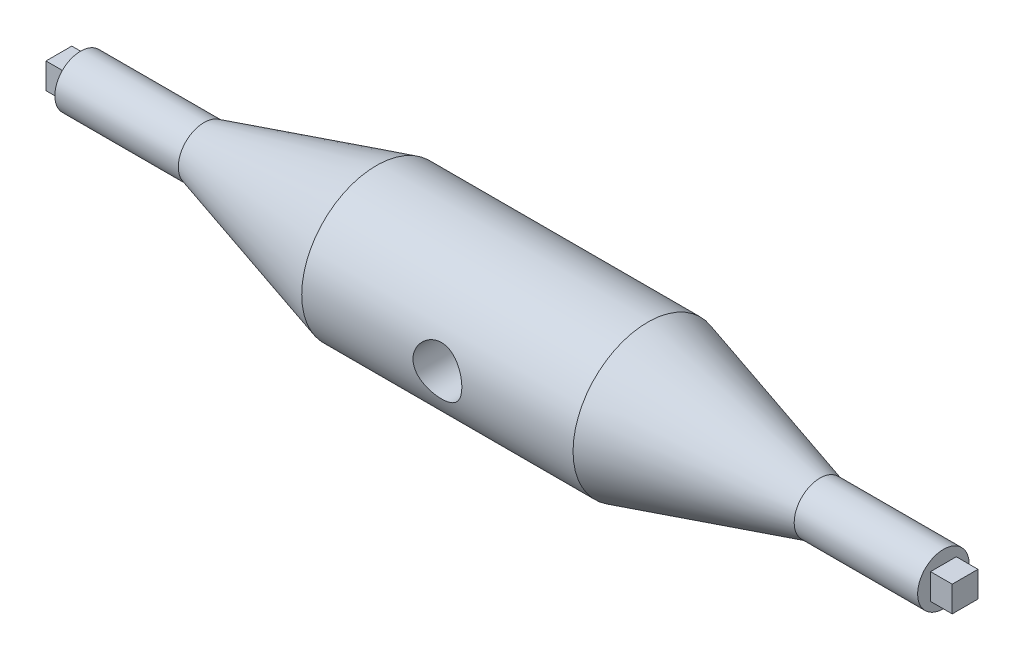
ISO-10303-21;
HEADER;
FILE_DESCRIPTION(('STEP AP214'),'2;1');
FILE_NAME('part.step','',(''),(''),'','','');
FILE_SCHEMA(('AUTOMOTIVE_DESIGN { 1 0 10303 214 1 1 1 1 }'));
ENDSEC;
DATA;
#1=APPLICATION_CONTEXT('core data for automotive mechanical design processes');
#2=APPLICATION_PROTOCOL_DEFINITION('international standard','automotive_design',2000,#1);
#3=PRODUCT_CONTEXT('',#1,'mechanical');
#4=PRODUCT('Part','Part','',(#3));
#5=PRODUCT_RELATED_PRODUCT_CATEGORY('part','',(#4));
#6=PRODUCT_DEFINITION_FORMATION('','',#4);
#7=PRODUCT_DEFINITION_CONTEXT('part definition',#1,'design');
#8=PRODUCT_DEFINITION('design','',#6,#7);
#9=PRODUCT_DEFINITION_SHAPE('','',#8);
#10=(LENGTH_UNIT() NAMED_UNIT(*) SI_UNIT(.MILLI.,.METRE.));
#11=(NAMED_UNIT(*) PLANE_ANGLE_UNIT() SI_UNIT($,.RADIAN.));
#12=(NAMED_UNIT(*) SI_UNIT($,.STERADIAN.) SOLID_ANGLE_UNIT());
#13=UNCERTAINTY_MEASURE_WITH_UNIT(LENGTH_MEASURE(1.E-05),#10,'distance_accuracy_value','');
#14=(GEOMETRIC_REPRESENTATION_CONTEXT(3) GLOBAL_UNCERTAINTY_ASSIGNED_CONTEXT((#13)) GLOBAL_UNIT_ASSIGNED_CONTEXT((#10,
#11,#12)) REPRESENTATION_CONTEXT('',''));
#15=CARTESIAN_POINT('',(0.,0.,0.));
#16=DIRECTION('',(0.,0.,1.));
#17=DIRECTION('',(1.,0.,0.));
#18=AXIS2_PLACEMENT_3D('',#15,#16,#17);
#19=CARTESIAN_POINT('',(0.,0.,-4.75));
#20=DIRECTION('',(-1.,0.,0.));
#21=DIRECTION('',(0.,0.,1.));
#22=AXIS2_PLACEMENT_3D('',#19,#20,#21);
#23=CYLINDRICAL_SURFACE('',#22,13.75);
#24=CARTESIAN_POINT('',(75.,0.,-18.5));
#25=CARTESIAN_POINT('',(74.9999997196814,-0.245786065139316,-18.5000000712777));
#26=CARTESIAN_POINT('',(75.0202027013687,-0.491572326353988,-18.4933485330587));
#27=CARTESIAN_POINT('',(75.1002441111839,-0.975920500530726,-18.4674683670359));
#28=CARTESIAN_POINT('',(75.1600880774559,-1.21448139918467,-18.4482379818772));
#29=CARTESIAN_POINT('',(75.3171511412998,-1.67732577943023,-18.3992930073657));
#30=CARTESIAN_POINT('',(75.4143091203274,-1.90163191306208,-18.3695955690492));
#31=CARTESIAN_POINT('',(75.6429707967424,-2.33076666177639,-18.3027580708703));
#32=CARTESIAN_POINT('',(75.7744808796623,-2.53559164594381,-18.2656166275799));
#33=CARTESIAN_POINT('',(76.0727478312504,-2.92681775758009,-18.1864170822302));
#34=CARTESIAN_POINT('',(76.2404497841196,-3.11247502874366,-18.1442443153947));
#35=CARTESIAN_POINT('',(76.6043298439425,-3.4535939764117,-18.060375843794));
#36=CARTESIAN_POINT('',(76.8005139085173,-3.60904931961388,-18.0186802408109));
#37=CARTESIAN_POINT('',(77.2224094277027,-3.88953413152262,-17.9392347417498));
#38=CARTESIAN_POINT('',(77.4487852197314,-4.01360787205096,-17.9016251176041));
#39=CARTESIAN_POINT('',(77.9206198036274,-4.22160798088068,-17.8363477443379));
#40=CARTESIAN_POINT('',(78.1660729864997,-4.30554609804398,-17.8086770863844));
#41=CARTESIAN_POINT('',(78.6606547117253,-4.42812205917826,-17.767615639146));
#42=CARTESIAN_POINT('',(78.9094014944405,-4.46814968030656,-17.7537880460554));
#43=CARTESIAN_POINT('',(79.4104350955964,-4.50611228151206,-17.7406848706641));
#44=CARTESIAN_POINT('',(79.6627208443762,-4.50405971768691,-17.7414049821165));
#45=CARTESIAN_POINT('',(80.151925709383,-4.45900162574923,-17.7569322356257));
#46=CARTESIAN_POINT('',(80.3890335928492,-4.41779558155579,-17.7711203628433));
#47=CARTESIAN_POINT('',(80.8527649102298,-4.29853044924797,-17.8109742715104));
#48=CARTESIAN_POINT('',(81.0793871277391,-4.22046709715819,-17.8366413809308));
#49=CARTESIAN_POINT('',(81.5198611487837,-4.0284980704993,-17.8970120874566));
#50=CARTESIAN_POINT('',(81.7334571392986,-3.91404982470537,-17.9318510060776));
#51=CARTESIAN_POINT('',(82.1389877034393,-3.65293644946906,-18.0065816008104));
#52=CARTESIAN_POINT('',(82.3309161802689,-3.5062622863455,-18.0464746923953));
#53=CARTESIAN_POINT('',(82.6977938616204,-3.17616239907852,-18.1292682916094));
#54=CARTESIAN_POINT('',(82.8714067469564,-2.99126119375416,-18.1722192312894));
#55=CARTESIAN_POINT('',(83.185502323745,-2.59443790020564,-18.2545326267411));
#56=CARTESIAN_POINT('',(83.3259820627789,-2.3825134065885,-18.2938947625312));
#57=CARTESIAN_POINT('',(83.5708481662276,-1.9349021785258,-18.3650802861685));
#58=CARTESIAN_POINT('',(83.6748881998884,-1.6990135468318,-18.3968304771161));
#59=CARTESIAN_POINT('',(83.8414010068992,-1.21179702443913,-18.4486843636488));
#60=CARTESIAN_POINT('',(83.9038876772946,-0.960474326234213,-18.4687919526773));
#61=CARTESIAN_POINT('',(83.9831796700511,-0.460845626035907,-18.4944555420021));
#62=CARTESIAN_POINT('',(84.001791682075,-0.212855495538742,-18.5005866982776));
#63=CARTESIAN_POINT('',(83.9979369391174,0.282746496029036,-18.4993244880918));
#64=CARTESIAN_POINT('',(83.975476836985,0.530358411860724,-18.4919333119739));
#65=CARTESIAN_POINT('',(83.8915514877486,1.01102211715996,-18.464836123943));
#66=CARTESIAN_POINT('',(83.8311851090193,1.24428725672125,-18.4454772811332));
#67=CARTESIAN_POINT('',(83.6745248294389,1.69729368701772,-18.3967446763095));
#68=CARTESIAN_POINT('',(83.5782263821243,1.91703326227069,-18.3673696469939));
#69=CARTESIAN_POINT('',(83.3496775921739,2.34305791611547,-18.3006566938414));
#70=CARTESIAN_POINT('',(83.2165648451776,2.54885044468066,-18.2631330999466));
#71=CARTESIAN_POINT('',(82.9191854315569,2.93577060041805,-18.1843887162314));
#72=CARTESIAN_POINT('',(82.754909558416,3.11689091144543,-18.1431668357285));
#73=CARTESIAN_POINT('',(82.3913684085962,3.45755805390074,-18.0593926019679));
#74=CARTESIAN_POINT('',(82.1908876198737,3.61581589413316,-18.0168608491164));
#75=CARTESIAN_POINT('',(81.7652973432049,3.8965892208586,-17.9371325997492));
#76=CARTESIAN_POINT('',(81.5401878477072,4.01910469639254,-17.8999361048695));
#77=CARTESIAN_POINT('',(81.0718157437455,4.22428239046055,-17.8354706774745));
#78=CARTESIAN_POINT('',(80.8286029638639,4.30704964748766,-17.8081756267177));
#79=CARTESIAN_POINT('',(80.3305990632936,4.43010358787342,-17.7669495555253));
#80=CARTESIAN_POINT('',(80.0758129612638,4.47040850459463,-17.7530127992596));
#81=CARTESIAN_POINT('',(79.5754767949964,4.50600400809907,-17.7407176260657));
#82=CARTESIAN_POINT('',(79.3300947892978,4.50342648939146,-17.7416213845889));
#83=CARTESIAN_POINT('',(78.8434519232678,4.4585473425561,-17.7570906034487));
#84=CARTESIAN_POINT('',(78.6021908349333,4.4162479194674,-17.7716553054401));
#85=CARTESIAN_POINT('',(78.1348575339261,4.2946112330784,-17.8122657288382));
#86=CARTESIAN_POINT('',(77.9085924744992,4.21594041093321,-17.8381044143385));
#87=CARTESIAN_POINT('',(77.4722973992493,4.02432911786228,-17.8982817337048));
#88=CARTESIAN_POINT('',(77.2622709151489,3.91138121818594,-17.9326222098365));
#89=CARTESIAN_POINT('',(76.8547838312516,3.6488401086801,-18.0077461879882));
#90=CARTESIAN_POINT('',(76.6582312677398,3.49789827282858,-18.0487408666685));
#91=CARTESIAN_POINT('',(76.2925559870872,3.16596135785421,-18.1316447152471));
#92=CARTESIAN_POINT('',(76.1234409236584,2.98495792142142,-18.1735541366274));
#93=CARTESIAN_POINT('',(75.8111378672551,2.58997752466538,-18.2554292010296));
#94=CARTESIAN_POINT('',(75.6691427052122,2.37502731424052,-18.2952652863026));
#95=CARTESIAN_POINT('',(75.4234665997777,1.9230155455172,-18.3667822737995));
#96=CARTESIAN_POINT('',(75.3197742602809,1.68596059029854,-18.3984656008326));
#97=CARTESIAN_POINT('',(75.1589589420307,1.21028269787754,-18.4485994873816));
#98=CARTESIAN_POINT('',(75.0995343289839,0.972506292811256,-18.4676969663001));
#99=CARTESIAN_POINT('',(75.0200599705785,0.489818778014967,-18.4933956088508));
#100=CARTESIAN_POINT('',(75.0000002793188,0.24490948634712,-18.4999999289765));
#101=CARTESIAN_POINT('',(75.,0.,-18.5));
#102=B_SPLINE_CURVE_WITH_KNOTS('',3,(#24,#25,#26,#27,#28,#29,#30,#31,#32,#33,#34,#35,#36,#37,
#38,#39,#40,#41,#42,#43,#44,#45,#46,#47,#48,#49,#50,#51,#52,#53,#54,#55,#56,#57,#58,#59,#60,#61,
#62,#63,#64,#65,#66,#67,#68,#69,#70,#71,#72,#73,#74,#75,#76,#77,#78,#79,#80,#81,#82,#83,#84,#85,
#86,#87,#88,#89,#90,#91,#92,#93,#94,#95,#96,#97,#98,#99,#100,#101),.UNSPECIFIED.,.T.,.F.,(4,2,2,
2,2,2,2,2,2,2,2,2,2,2,2,2,2,2,2,2,2,2,2,2,2,2,2,2,2,2,2,2,2,2,2,2,2,2,4),(0.,0.736457253404454,
1.47301741714014,2.20837624124195,2.94387185473528,3.70159489222123,4.45947665207564,
5.2382284197566,6.01675208441972,6.76985297932246,7.52273095308503,8.24259980871784,
8.96255196548307,9.69378772145332,10.4252287221006,11.193393958387,11.9616276182773,
12.7369763191114,13.5120655828874,14.2546336933887,14.997081533575,15.7189415728673,
16.4408929796724,17.1814461652095,17.9222184739197,18.6953693944345,19.4685205520073,
20.2396171845423,21.0103825724493,21.7429491848238,22.4754751334253,23.1950806292773,
23.914842194212,24.6650663060309,25.415499334965,26.1937376306032,26.9717441928573,
27.705760402709,28.4395911328834),.UNSPECIFIED.);
#103=CARTESIAN_POINT('',(75.,0.,-18.5));
#104=VERTEX_POINT('',#103);
#105=EDGE_CURVE('E192',#104,#104,#102,.T.);
#106=ORIENTED_EDGE('',*,*,#105,.T.);
#107=EDGE_LOOP('',(#106));
#108=FACE_BOUND('',#107,.T.);
#109=CARTESIAN_POINT('',(104.5,0.,-4.75));
#110=DIRECTION('',(-1.,0.,0.));
#111=DIRECTION('',(0.,0.,1.));
#112=AXIS2_PLACEMENT_3D('',#109,#110,#111);
#113=CIRCLE('',#112,13.75);
#114=CARTESIAN_POINT('',(104.5,0.,8.99999999999999));
#115=VERTEX_POINT('',#114);
#116=EDGE_CURVE('E185',#115,#115,#113,.T.);
#117=ORIENTED_EDGE('',*,*,#116,.T.);
#118=EDGE_LOOP('',(#117));
#119=FACE_BOUND('',#118,.T.);
#120=CARTESIAN_POINT('',(54.5,0.,-4.75));
#121=DIRECTION('',(-1.,0.,0.));
#122=DIRECTION('',(0.,0.,1.));
#123=AXIS2_PLACEMENT_3D('',#120,#121,#122);
#124=CIRCLE('',#123,13.75);
#125=CARTESIAN_POINT('',(54.5,0.,9.));
#126=VERTEX_POINT('',#125);
#127=EDGE_CURVE('E182',#126,#126,#124,.T.);
#128=ORIENTED_EDGE('',*,*,#127,.F.);
#129=EDGE_LOOP('',(#128));
#130=FACE_BOUND('',#129,.T.);
#131=CARTESIAN_POINT('',(84.,0.,8.99999999999999));
#132=CARTESIAN_POINT('',(84.0000002803185,-0.24578606513933,9.00000007127768));
#133=CARTESIAN_POINT('',(83.9797972986312,-0.491572326354004,8.99334853305867));
#134=CARTESIAN_POINT('',(83.899755888816,-0.97592050053074,8.96746836703592));
#135=CARTESIAN_POINT('',(83.839911922544,-1.21448139918468,8.94823798187723));
#136=CARTESIAN_POINT('',(83.6828488587002,-1.67732577943025,8.89929300736574));
#137=CARTESIAN_POINT('',(83.5856908796725,-1.9016319130621,8.8695955690492));
#138=CARTESIAN_POINT('',(83.3570292032575,-2.33076666177641,8.8027580708703));
#139=CARTESIAN_POINT('',(83.2255191203376,-2.53559164594383,8.76561662757989));
#140=CARTESIAN_POINT('',(82.9272521687495,-2.9268177575801,8.68641708223022));
#141=CARTESIAN_POINT('',(82.7595502158803,-3.11247502874367,8.64424431539467));
#142=CARTESIAN_POINT('',(82.3956701560575,-3.45359397641171,8.56037584379399));
#143=CARTESIAN_POINT('',(82.1994860914827,-3.60904931961389,8.51868024081089));
#144=CARTESIAN_POINT('',(81.7775905722972,-3.88953413152263,8.4392347417498));
#145=CARTESIAN_POINT('',(81.5512147802685,-4.01360787205097,8.40162511760413));
#146=CARTESIAN_POINT('',(81.0793801963725,-4.22160798088068,8.33634774433792));
#147=CARTESIAN_POINT('',(80.8339270135003,-4.30554609804399,8.30867708638435));
#148=CARTESIAN_POINT('',(80.3393452882746,-4.42812205917826,8.26761563914595));
#149=CARTESIAN_POINT('',(80.0905985055594,-4.46814968030656,8.25378804605537));
#150=CARTESIAN_POINT('',(79.5895649044036,-4.50611228151206,8.24068487066413));
#151=CARTESIAN_POINT('',(79.3372791556237,-4.50405971768691,8.24140498211653));
#152=CARTESIAN_POINT('',(78.8480742906169,-4.45900162574923,8.25693223562571));
#153=CARTESIAN_POINT('',(78.6109664071507,-4.41779558155579,8.27112036284326));
#154=CARTESIAN_POINT('',(78.1472350897701,-4.29853044924797,8.31097427151042));
#155=CARTESIAN_POINT('',(77.9206128722608,-4.22046709715819,8.33664138093084));
#156=CARTESIAN_POINT('',(77.4801388512162,-4.0284980704993,8.39701208745663));
#157=CARTESIAN_POINT('',(77.2665428607014,-3.91404982470536,8.43185100607758));
#158=CARTESIAN_POINT('',(76.8610122965606,-3.65293644946905,8.50658160081036));
#159=CARTESIAN_POINT('',(76.669083819731,-3.50626228634549,8.54647469239532));
#160=CARTESIAN_POINT('',(76.3022061383796,-3.17616239907851,8.62926829160939));
#161=CARTESIAN_POINT('',(76.1285932530435,-2.99126119375416,8.6722192312894));
#162=CARTESIAN_POINT('',(75.8144976762549,-2.59443790020563,8.75453262674113));
#163=CARTESIAN_POINT('',(75.6740179372211,-2.38251340658849,8.7938947625312));
#164=CARTESIAN_POINT('',(75.4291518337723,-1.93490217852579,8.86508028616849));
#165=CARTESIAN_POINT('',(75.3251118001116,-1.6990135468318,8.89683047711615));
#166=CARTESIAN_POINT('',(75.1585989931007,-1.21179702443912,8.94868436364884));
#167=CARTESIAN_POINT('',(75.0961123227053,-0.960474326234203,8.96879195267727));
#168=CARTESIAN_POINT('',(75.0168203299489,-0.460845626035895,8.99445554200213));
#169=CARTESIAN_POINT('',(74.9982083179249,-0.212855495538729,9.00058669827764));
#170=CARTESIAN_POINT('',(75.0020630608826,0.282746496029052,8.9993244880918));
#171=CARTESIAN_POINT('',(75.0245231630149,0.530358411860741,8.99193331197387));
#172=CARTESIAN_POINT('',(75.1084485122514,1.01102211715998,8.96483612394298));
#173=CARTESIAN_POINT('',(75.1688148909806,1.24428725672127,8.94547728113321));
#174=CARTESIAN_POINT('',(75.3254751705611,1.69729368701774,8.89674467630947));
#175=CARTESIAN_POINT('',(75.4217736178756,1.91703326227071,8.86736964699391));
#176=CARTESIAN_POINT('',(75.6503224078261,2.34305791611548,8.80065669384138));
#177=CARTESIAN_POINT('',(75.7834351548224,2.54885044468068,8.76313309994661));
#178=CARTESIAN_POINT('',(76.080814568443,2.93577060041806,8.68438871623142));
#179=CARTESIAN_POINT('',(76.2450904415839,3.11689091144544,8.6431668357285));
#180=CARTESIAN_POINT('',(76.6086315914037,3.45755805390076,8.55939260196794));
#181=CARTESIAN_POINT('',(76.8091123801263,3.61581589413317,8.51686084911636));
#182=CARTESIAN_POINT('',(77.234702656795,3.89658922085861,8.43713259974923));
#183=CARTESIAN_POINT('',(77.4598121522927,4.01910469639255,8.39993610486953));
#184=CARTESIAN_POINT('',(77.9281842562544,4.22428239046055,8.33547067747446));
#185=CARTESIAN_POINT('',(78.171397036136,4.30704964748766,8.3081756267177));
#186=CARTESIAN_POINT('',(78.6694009367064,4.43010358787342,8.26694955552535));
#187=CARTESIAN_POINT('',(78.9241870387362,4.47040850459463,8.25301279925961));
#188=CARTESIAN_POINT('',(79.4245232050036,4.50600400809907,8.2407176260657));
#189=CARTESIAN_POINT('',(79.6699052107022,4.50342648939146,8.24162138458887));
#190=CARTESIAN_POINT('',(80.1565480767322,4.4585473425561,8.25709060344867));
#191=CARTESIAN_POINT('',(80.3978091650667,4.4162479194674,8.2716553054401));
#192=CARTESIAN_POINT('',(80.8651424660738,4.29461123307839,8.31226572883818));
#193=CARTESIAN_POINT('',(81.0914075255007,4.21594041093321,8.33810441433847));
#194=CARTESIAN_POINT('',(81.5277026007507,4.02432911786228,8.39828173370478));
#195=CARTESIAN_POINT('',(81.737729084851,3.91138121818593,8.43262220983653));
#196=CARTESIAN_POINT('',(82.1452161687484,3.64884010868009,8.50774618798825));
#197=CARTESIAN_POINT('',(82.3417687322602,3.49789827282856,8.54874086666855));
#198=CARTESIAN_POINT('',(82.7074440129128,3.16596135785419,8.63164471524713));
#199=CARTESIAN_POINT('',(82.8765590763415,2.9849579214214,8.67355413662744));
#200=CARTESIAN_POINT('',(83.1888621327449,2.58997752466537,8.75542920102964));
#201=CARTESIAN_POINT('',(83.3308572947878,2.37502731424051,8.79526528630257));
#202=CARTESIAN_POINT('',(83.5765334002223,1.92301554551719,8.86678227379947));
#203=CARTESIAN_POINT('',(83.6802257397191,1.68596059029853,8.89846560083264));
#204=CARTESIAN_POINT('',(83.8410410579693,1.21028269787753,8.94859948738158));
#205=CARTESIAN_POINT('',(83.900465671016,0.972506292811245,8.96769696630012));
#206=CARTESIAN_POINT('',(83.9799400294214,0.489818778014954,8.9933956088508));
#207=CARTESIAN_POINT('',(83.9999997206812,0.244909486347107,8.99999992897651));
#208=CARTESIAN_POINT('',(84.,0.,8.99999999999999));
#209=B_SPLINE_CURVE_WITH_KNOTS('',3,(#131,#132,#133,#134,#135,#136,#137,#138,#139,#140,#141,
#142,#143,#144,#145,#146,#147,#148,#149,#150,#151,#152,#153,#154,#155,#156,#157,#158,#159,#160,
#161,#162,#163,#164,#165,#166,#167,#168,#169,#170,#171,#172,#173,#174,#175,#176,#177,#178,#179,
#180,#181,#182,#183,#184,#185,#186,#187,#188,#189,#190,#191,#192,#193,#194,#195,#196,#197,#198,
#199,#200,#201,#202,#203,#204,#205,#206,#207,#208),.UNSPECIFIED.,.T.,.F.,(4,2,2,2,2,2,2,2,2,2,2,
2,2,2,2,2,2,2,2,2,2,2,2,2,2,2,2,2,2,2,2,2,2,2,2,2,2,2,4),(0.,0.736457253404455,1.47301741714014,
2.20837624124197,2.94387185473528,3.70159489222124,4.45947665207564,5.23822841975661,
6.01675208441972,6.76985297932247,7.52273095308503,8.24259980871785,8.96255196548307,
9.69378772145331,10.4252287221006,11.193393958387,11.9616276182773,12.7369763191114,
13.5120655828874,14.2546336933887,14.997081533575,15.7189415728673,16.4408929796724,
17.1814461652095,17.9222184739197,18.6953693944344,19.4685205520073,20.2396171845422,
21.0103825724493,21.7429491848238,22.4754751334253,23.1950806292773,23.914842194212,
24.6650663060309,25.415499334965,26.1937376306032,26.9717441928573,27.705760402709,
28.4395911328834),.UNSPECIFIED.);
#210=CARTESIAN_POINT('',(84.,0.,8.99999999999999));
#211=VERTEX_POINT('',#210);
#212=EDGE_CURVE('E42',#211,#211,#209,.T.);
#213=ORIENTED_EDGE('',*,*,#212,.T.);
#214=EDGE_LOOP('',(#213));
#215=FACE_BOUND('',#214,.T.);
#216=ADVANCED_FACE('F38',(#108,#119,#130,#215),#23,.T.);
#217=CARTESIAN_POINT('',(0.,0.,-4.75));
#218=DIRECTION('',(-1.,0.,0.));
#219=DIRECTION('',(0.,0.,1.));
#220=AXIS2_PLACEMENT_3D('',#217,#218,#219);
#221=CYLINDRICAL_SURFACE('',#220,4.75);
#222=CARTESIAN_POINT('',(22.75,0.,-4.75));
#223=DIRECTION('',(-1.,0.,0.));
#224=DIRECTION('',(0.,0.,1.));
#225=AXIS2_PLACEMENT_3D('',#222,#223,#224);
#226=CIRCLE('',#225,4.75);
#227=CARTESIAN_POINT('',(22.75,0.,0.));
#228=VERTEX_POINT('',#227);
#229=EDGE_CURVE('E179',#228,#228,#226,.T.);
#230=ORIENTED_EDGE('',*,*,#229,.T.);
#231=EDGE_LOOP('',(#230));
#232=FACE_BOUND('',#231,.T.);
#233=CARTESIAN_POINT('',(0.,0.,-4.75));
#234=DIRECTION('',(-1.,0.,0.));
#235=DIRECTION('',(0.,0.,1.));
#236=AXIS2_PLACEMENT_3D('',#233,#234,#235);
#237=CIRCLE('',#236,4.75);
#238=CARTESIAN_POINT('',(0.,0.,0.));
#239=VERTEX_POINT('',#238);
#240=EDGE_CURVE('E11',#239,#239,#237,.T.);
#241=ORIENTED_EDGE('',*,*,#240,.F.);
#242=EDGE_LOOP('',(#241));
#243=FACE_BOUND('',#242,.T.);
#244=ADVANCED_FACE('F40',(#232,#243),#221,.T.);
#245=CARTESIAN_POINT('',(0.,0.,0.));
#246=DIRECTION('',(-1.,0.,0.));
#247=DIRECTION('',(0.,0.,1.));
#248=AXIS2_PLACEMENT_3D('',#245,#246,#247);
#249=PLANE('',#248);
#250=DIRECTION('',(0.,0.,-1.));
#251=VECTOR('',#250,1.);
#252=CARTESIAN_POINT('',(0.,2.375,-4.75));
#253=LINE('',#252,#251);
#254=CARTESIAN_POINT('',(0.,2.375,-2.375));
#255=VERTEX_POINT('',#254);
#256=CARTESIAN_POINT('',(0.,2.375,-7.125));
#257=VERTEX_POINT('',#256);
#258=EDGE_CURVE('E60',#255,#257,#253,.T.);
#259=ORIENTED_EDGE('',*,*,#258,.F.);
#260=DIRECTION('',(0.,1.,0.));
#261=VECTOR('',#260,1.);
#262=CARTESIAN_POINT('',(0.,-2.375,-2.375));
#263=LINE('',#262,#261);
#264=CARTESIAN_POINT('',(0.,-2.375,-2.375));
#265=VERTEX_POINT('',#264);
#266=EDGE_CURVE('E64',#265,#255,#263,.T.);
#267=ORIENTED_EDGE('',*,*,#266,.F.);
#268=DIRECTION('',(0.,0.,1.));
#269=VECTOR('',#268,1.);
#270=CARTESIAN_POINT('',(0.,-2.375,-7.125));
#271=LINE('',#270,#269);
#272=CARTESIAN_POINT('',(0.,-2.375,-7.125));
#273=VERTEX_POINT('',#272);
#274=EDGE_CURVE('E139',#273,#265,#271,.T.);
#275=ORIENTED_EDGE('',*,*,#274,.F.);
#276=DIRECTION('',(0.,-1.,0.));
#277=VECTOR('',#276,1.);
#278=CARTESIAN_POINT('',(0.,2.375,-7.125));
#279=LINE('',#278,#277);
#280=EDGE_CURVE('E137',#257,#273,#279,.T.);
#281=ORIENTED_EDGE('',*,*,#280,.F.);
#282=EDGE_LOOP('',(#259,#267,#275,#281));
#283=FACE_BOUND('',#282,.T.);
#284=ORIENTED_EDGE('',*,*,#240,.T.);
#285=EDGE_LOOP('',(#284));
#286=FACE_BOUND('',#285,.T.);
#287=ADVANCED_FACE('F254',(#283,#286),#249,.T.);
#288=CARTESIAN_POINT('',(159.,0.,-4.75));
#289=DIRECTION('',(1.,0.,0.));
#290=DIRECTION('',(0.,0.,-1.));
#291=AXIS2_PLACEMENT_3D('',#288,#289,#290);
#292=PLANE('',#291);
#293=DIRECTION('',(0.,0.,1.));
#294=VECTOR('',#293,1.);
#295=CARTESIAN_POINT('',(159.,2.375,-2.375));
#296=LINE('',#295,#294);
#297=CARTESIAN_POINT('',(159.,2.375,-7.125));
#298=VERTEX_POINT('',#297);
#299=CARTESIAN_POINT('',(159.,2.375,-2.375));
#300=VERTEX_POINT('',#299);
#301=EDGE_CURVE('E124',#298,#300,#296,.T.);
#302=ORIENTED_EDGE('',*,*,#301,.F.);
#303=DIRECTION('',(0.,1.,0.));
#304=VECTOR('',#303,1.);
#305=CARTESIAN_POINT('',(159.,2.375,-7.125));
#306=LINE('',#305,#304);
#307=CARTESIAN_POINT('',(159.,-2.375,-7.125));
#308=VERTEX_POINT('',#307);
#309=EDGE_CURVE('E151',#308,#298,#306,.T.);
#310=ORIENTED_EDGE('',*,*,#309,.F.);
#311=DIRECTION('',(0.,0.,-1.));
#312=VECTOR('',#311,1.);
#313=CARTESIAN_POINT('',(159.,-2.375,-7.125));
#314=LINE('',#313,#312);
#315=CARTESIAN_POINT('',(159.,-2.375,-2.375));
#316=VERTEX_POINT('',#315);
#317=EDGE_CURVE('E163',#316,#308,#314,.T.);
#318=ORIENTED_EDGE('',*,*,#317,.F.);
#319=DIRECTION('',(0.,-1.,0.));
#320=VECTOR('',#319,1.);
#321=CARTESIAN_POINT('',(159.,2.375,-2.375));
#322=LINE('',#321,#320);
#323=EDGE_CURVE('E160',#300,#316,#322,.T.);
#324=ORIENTED_EDGE('',*,*,#323,.F.);
#325=EDGE_LOOP('',(#302,#310,#318,#324));
#326=FACE_BOUND('',#325,.T.);
#327=CARTESIAN_POINT('',(159.,0.,-4.75));
#328=DIRECTION('',(-1.,0.,0.));
#329=DIRECTION('',(0.,0.,1.));
#330=AXIS2_PLACEMENT_3D('',#327,#328,#329);
#331=CIRCLE('',#330,4.75);
#332=CARTESIAN_POINT('',(159.,0.,0.));
#333=VERTEX_POINT('',#332);
#334=EDGE_CURVE('E52',#333,#333,#331,.T.);
#335=ORIENTED_EDGE('',*,*,#334,.F.);
#336=EDGE_LOOP('',(#335));
#337=FACE_BOUND('',#336,.T.);
#338=ADVANCED_FACE('F269',(#326,#337),#292,.T.);
#339=CARTESIAN_POINT('',(0.,0.,-4.75));
#340=DIRECTION('',(-1.,0.,0.));
#341=DIRECTION('',(0.,0.,1.));
#342=AXIS2_PLACEMENT_3D('',#339,#340,#341);
#343=CYLINDRICAL_SURFACE('',#342,4.75);
#344=ORIENTED_EDGE('',*,*,#334,.T.);
#345=EDGE_LOOP('',(#344));
#346=FACE_BOUND('',#345,.T.);
#347=CARTESIAN_POINT('',(136.25,0.,-4.75));
#348=DIRECTION('',(-1.,0.,0.));
#349=DIRECTION('',(0.,0.,1.));
#350=AXIS2_PLACEMENT_3D('',#347,#348,#349);
#351=CIRCLE('',#350,4.74999999999999);
#352=CARTESIAN_POINT('',(136.25,0.,0.));
#353=VERTEX_POINT('',#352);
#354=EDGE_CURVE('E188',#353,#353,#351,.T.);
#355=ORIENTED_EDGE('',*,*,#354,.F.);
#356=EDGE_LOOP('',(#355));
#357=FACE_BOUND('',#356,.T.);
#358=ADVANCED_FACE('F246',(#346,#357),#343,.T.);
#359=CARTESIAN_POINT('',(104.5,0.,-4.75));
#360=DIRECTION('',(-1.,0.,0.));
#361=DIRECTION('',(0.,0.,1.));
#362=AXIS2_PLACEMENT_3D('',#359,#360,#361);
#363=CONICAL_SURFACE('',#362,13.75,0.276218496557133);
#364=ORIENTED_EDGE('',*,*,#354,.T.);
#365=EDGE_LOOP('',(#364));
#366=FACE_BOUND('',#365,.T.);
#367=ORIENTED_EDGE('',*,*,#116,.F.);
#368=EDGE_LOOP('',(#367));
#369=FACE_BOUND('',#368,.T.);
#370=ADVANCED_FACE('F241',(#366,#369),#363,.T.);
#371=CARTESIAN_POINT('',(22.75,0.,-4.75));
#372=DIRECTION('',(1.,0.,0.));
#373=DIRECTION('',(0.,0.,-1.));
#374=AXIS2_PLACEMENT_3D('',#371,#372,#373);
#375=CONICAL_SURFACE('',#374,4.75,0.276218496557132);
#376=ORIENTED_EDGE('',*,*,#127,.T.);
#377=EDGE_LOOP('',(#376));
#378=FACE_BOUND('',#377,.T.);
#379=ORIENTED_EDGE('',*,*,#229,.F.);
#380=EDGE_LOOP('',(#379));
#381=FACE_BOUND('',#380,.T.);
#382=ADVANCED_FACE('F238',(#378,#381),#375,.T.);
#383=CARTESIAN_POINT('',(163.,2.375,-2.375));
#384=DIRECTION('',(0.,-1.,0.));
#385=DIRECTION('',(0.,0.,-1.));
#386=AXIS2_PLACEMENT_3D('',#383,#384,#385);
#387=PLANE('',#386);
#388=ORIENTED_EDGE('',*,*,#301,.T.);
#389=DIRECTION('',(-1.,0.,0.));
#390=VECTOR('',#389,1.);
#391=CARTESIAN_POINT('',(163.,2.375,-2.375));
#392=LINE('',#391,#390);
#393=CARTESIAN_POINT('',(163.,2.375,-2.375));
#394=VERTEX_POINT('',#393);
#395=EDGE_CURVE('E176',#394,#300,#392,.T.);
#396=ORIENTED_EDGE('',*,*,#395,.F.);
#397=DIRECTION('',(0.,0.,1.));
#398=VECTOR('',#397,1.);
#399=CARTESIAN_POINT('',(163.,2.375,-2.375));
#400=LINE('',#399,#398);
#401=CARTESIAN_POINT('',(163.,2.375,-7.125));
#402=VERTEX_POINT('',#401);
#403=EDGE_CURVE('E147',#402,#394,#400,.T.);
#404=ORIENTED_EDGE('',*,*,#403,.F.);
#405=DIRECTION('',(-1.,0.,0.));
#406=VECTOR('',#405,1.);
#407=CARTESIAN_POINT('',(163.,2.375,-7.125));
#408=LINE('',#407,#406);
#409=EDGE_CURVE('E157',#402,#298,#408,.T.);
#410=ORIENTED_EDGE('',*,*,#409,.T.);
#411=EDGE_LOOP('',(#388,#396,#404,#410));
#412=FACE_BOUND('',#411,.T.);
#413=ADVANCED_FACE('F235',(#412),#387,.F.);
#414=CARTESIAN_POINT('',(163.,2.375,-2.375));
#415=DIRECTION('',(0.,0.,-1.));
#416=DIRECTION('',(0.,1.,0.));
#417=AXIS2_PLACEMENT_3D('',#414,#415,#416);
#418=PLANE('',#417);
#419=ORIENTED_EDGE('',*,*,#323,.T.);
#420=DIRECTION('',(-1.,0.,0.));
#421=VECTOR('',#420,1.);
#422=CARTESIAN_POINT('',(163.,-2.375,-2.375));
#423=LINE('',#422,#421);
#424=CARTESIAN_POINT('',(163.,-2.375,-2.375));
#425=VERTEX_POINT('',#424);
#426=EDGE_CURVE('E173',#425,#316,#423,.T.);
#427=ORIENTED_EDGE('',*,*,#426,.F.);
#428=DIRECTION('',(0.,-1.,0.));
#429=VECTOR('',#428,1.);
#430=CARTESIAN_POINT('',(163.,2.375,-2.375));
#431=LINE('',#430,#429);
#432=EDGE_CURVE('E150',#394,#425,#431,.T.);
#433=ORIENTED_EDGE('',*,*,#432,.F.);
#434=ORIENTED_EDGE('',*,*,#395,.T.);
#435=EDGE_LOOP('',(#419,#427,#433,#434));
#436=FACE_BOUND('',#435,.T.);
#437=ADVANCED_FACE('F231',(#436),#418,.F.);
#438=CARTESIAN_POINT('',(163.,-2.375,-7.125));
#439=DIRECTION('',(0.,1.,0.));
#440=DIRECTION('',(0.,0.,1.));
#441=AXIS2_PLACEMENT_3D('',#438,#439,#440);
#442=PLANE('',#441);
#443=ORIENTED_EDGE('',*,*,#317,.T.);
#444=DIRECTION('',(-1.,0.,0.));
#445=VECTOR('',#444,1.);
#446=CARTESIAN_POINT('',(163.,-2.375,-7.125));
#447=LINE('',#446,#445);
#448=CARTESIAN_POINT('',(163.,-2.375,-7.125));
#449=VERTEX_POINT('',#448);
#450=EDGE_CURVE('E170',#449,#308,#447,.T.);
#451=ORIENTED_EDGE('',*,*,#450,.F.);
#452=DIRECTION('',(0.,0.,-1.));
#453=VECTOR('',#452,1.);
#454=CARTESIAN_POINT('',(163.,-2.375,-7.125));
#455=LINE('',#454,#453);
#456=EDGE_CURVE('E153',#425,#449,#455,.T.);
#457=ORIENTED_EDGE('',*,*,#456,.F.);
#458=ORIENTED_EDGE('',*,*,#426,.T.);
#459=EDGE_LOOP('',(#443,#451,#457,#458));
#460=FACE_BOUND('',#459,.T.);
#461=ADVANCED_FACE('F227',(#460),#442,.F.);
#462=CARTESIAN_POINT('',(163.,2.375,-7.125));
#463=DIRECTION('',(0.,0.,1.));
#464=DIRECTION('',(1.,0.,0.));
#465=AXIS2_PLACEMENT_3D('',#462,#463,#464);
#466=PLANE('',#465);
#467=ORIENTED_EDGE('',*,*,#309,.T.);
#468=ORIENTED_EDGE('',*,*,#409,.F.);
#469=DIRECTION('',(0.,1.,0.));
#470=VECTOR('',#469,1.);
#471=CARTESIAN_POINT('',(163.,2.375,-7.125));
#472=LINE('',#471,#470);
#473=EDGE_CURVE('E155',#449,#402,#472,.T.);
#474=ORIENTED_EDGE('',*,*,#473,.F.);
#475=ORIENTED_EDGE('',*,*,#450,.T.);
#476=EDGE_LOOP('',(#467,#468,#474,#475));
#477=FACE_BOUND('',#476,.T.);
#478=ADVANCED_FACE('F223',(#477),#466,.F.);
#479=CARTESIAN_POINT('',(163.,0.,0.));
#480=DIRECTION('',(-1.,0.,0.));
#481=DIRECTION('',(0.,0.,1.));
#482=AXIS2_PLACEMENT_3D('',#479,#480,#481);
#483=PLANE('',#482);
#484=ORIENTED_EDGE('',*,*,#403,.T.);
#485=ORIENTED_EDGE('',*,*,#432,.T.);
#486=ORIENTED_EDGE('',*,*,#456,.T.);
#487=ORIENTED_EDGE('',*,*,#473,.T.);
#488=EDGE_LOOP('',(#484,#485,#486,#487));
#489=FACE_BOUND('',#488,.T.);
#490=ADVANCED_FACE('F220',(#489),#483,.F.);
#491=CARTESIAN_POINT('',(-4.,2.375,-4.75));
#492=DIRECTION('',(0.,-1.,0.));
#493=DIRECTION('',(0.,0.,-1.));
#494=AXIS2_PLACEMENT_3D('',#491,#492,#493);
#495=PLANE('',#494);
#496=ORIENTED_EDGE('',*,*,#258,.T.);
#497=DIRECTION('',(1.,0.,0.));
#498=VECTOR('',#497,1.);
#499=CARTESIAN_POINT('',(-4.,2.375,-7.125));
#500=LINE('',#499,#498);
#501=CARTESIAN_POINT('',(-4.,2.375,-7.125));
#502=VERTEX_POINT('',#501);
#503=EDGE_CURVE('E120',#502,#257,#500,.T.);
#504=ORIENTED_EDGE('',*,*,#503,.F.);
#505=DIRECTION('',(0.,0.,-1.));
#506=VECTOR('',#505,1.);
#507=CARTESIAN_POINT('',(-4.,2.375,-2.375));
#508=LINE('',#507,#506);
#509=CARTESIAN_POINT('',(-4.,2.375,-2.375));
#510=VERTEX_POINT('',#509);
#511=EDGE_CURVE('E107',#510,#502,#508,.T.);
#512=ORIENTED_EDGE('',*,*,#511,.F.);
#513=DIRECTION('',(1.,0.,0.));
#514=VECTOR('',#513,1.);
#515=CARTESIAN_POINT('',(-4.,2.375,-2.375));
#516=LINE('',#515,#514);
#517=EDGE_CURVE('E135',#510,#255,#516,.T.);
#518=ORIENTED_EDGE('',*,*,#517,.T.);
#519=EDGE_LOOP('',(#496,#504,#512,#518));
#520=FACE_BOUND('',#519,.T.);
#521=ADVANCED_FACE('F121',(#520),#495,.F.);
#522=CARTESIAN_POINT('',(-4.,2.375,-7.125));
#523=DIRECTION('',(0.,0.,1.));
#524=DIRECTION('',(1.,0.,0.));
#525=AXIS2_PLACEMENT_3D('',#522,#523,#524);
#526=PLANE('',#525);
#527=ORIENTED_EDGE('',*,*,#280,.T.);
#528=DIRECTION('',(1.,0.,0.));
#529=VECTOR('',#528,1.);
#530=CARTESIAN_POINT('',(-4.,-2.375,-7.125));
#531=LINE('',#530,#529);
#532=CARTESIAN_POINT('',(-4.,-2.375,-7.125));
#533=VERTEX_POINT('',#532);
#534=EDGE_CURVE('E125',#533,#273,#531,.T.);
#535=ORIENTED_EDGE('',*,*,#534,.F.);
#536=DIRECTION('',(0.,-1.,0.));
#537=VECTOR('',#536,1.);
#538=CARTESIAN_POINT('',(-4.,2.375,-7.125));
#539=LINE('',#538,#537);
#540=EDGE_CURVE('E111',#502,#533,#539,.T.);
#541=ORIENTED_EDGE('',*,*,#540,.F.);
#542=ORIENTED_EDGE('',*,*,#503,.T.);
#543=EDGE_LOOP('',(#527,#535,#541,#542));
#544=FACE_BOUND('',#543,.T.);
#545=ADVANCED_FACE('F127',(#544),#526,.F.);
#546=CARTESIAN_POINT('',(-4.,-2.375,-7.125));
#547=DIRECTION('',(0.,1.,0.));
#548=DIRECTION('',(0.,0.,1.));
#549=AXIS2_PLACEMENT_3D('',#546,#547,#548);
#550=PLANE('',#549);
#551=ORIENTED_EDGE('',*,*,#274,.T.);
#552=DIRECTION('',(1.,0.,0.));
#553=VECTOR('',#552,1.);
#554=CARTESIAN_POINT('',(-4.,-2.375,-2.375));
#555=LINE('',#554,#553);
#556=CARTESIAN_POINT('',(-4.,-2.375,-2.375));
#557=VERTEX_POINT('',#556);
#558=EDGE_CURVE('E143',#557,#265,#555,.T.);
#559=ORIENTED_EDGE('',*,*,#558,.F.);
#560=DIRECTION('',(0.,0.,1.));
#561=VECTOR('',#560,1.);
#562=CARTESIAN_POINT('',(-4.,-2.375,-7.125));
#563=LINE('',#562,#561);
#564=EDGE_CURVE('E130',#533,#557,#563,.T.);
#565=ORIENTED_EDGE('',*,*,#564,.F.);
#566=ORIENTED_EDGE('',*,*,#534,.T.);
#567=EDGE_LOOP('',(#551,#559,#565,#566));
#568=FACE_BOUND('',#567,.T.);
#569=ADVANCED_FACE('F211',(#568),#550,.F.);
#570=CARTESIAN_POINT('',(-4.,-2.375,-2.375));
#571=DIRECTION('',(0.,0.,-1.));
#572=DIRECTION('',(-1.,0.,0.));
#573=AXIS2_PLACEMENT_3D('',#570,#571,#572);
#574=PLANE('',#573);
#575=ORIENTED_EDGE('',*,*,#266,.T.);
#576=ORIENTED_EDGE('',*,*,#517,.F.);
#577=DIRECTION('',(0.,1.,0.));
#578=VECTOR('',#577,1.);
#579=CARTESIAN_POINT('',(-4.,-2.375,-2.375));
#580=LINE('',#579,#578);
#581=EDGE_CURVE('E114',#557,#510,#580,.T.);
#582=ORIENTED_EDGE('',*,*,#581,.F.);
#583=ORIENTED_EDGE('',*,*,#558,.T.);
#584=EDGE_LOOP('',(#575,#576,#582,#583));
#585=FACE_BOUND('',#584,.T.);
#586=ADVANCED_FACE('F208',(#585),#574,.F.);
#587=CARTESIAN_POINT('',(-4.,0.,0.));
#588=DIRECTION('',(-1.,0.,0.));
#589=DIRECTION('',(0.,0.,1.));
#590=AXIS2_PLACEMENT_3D('',#587,#588,#589);
#591=PLANE('',#590);
#592=ORIENTED_EDGE('',*,*,#511,.T.);
#593=ORIENTED_EDGE('',*,*,#540,.T.);
#594=ORIENTED_EDGE('',*,*,#564,.T.);
#595=ORIENTED_EDGE('',*,*,#581,.T.);
#596=EDGE_LOOP('',(#592,#593,#594,#595));
#597=FACE_BOUND('',#596,.T.);
#598=ADVANCED_FACE('F109',(#597),#591,.T.);
#599=CARTESIAN_POINT('',(79.5,0.,37.625));
#600=DIRECTION('',(0.,0.,-1.));
#601=DIRECTION('',(-1.,0.,0.));
#602=AXIS2_PLACEMENT_3D('',#599,#600,#601);
#603=CYLINDRICAL_SURFACE('',#602,4.5);
#604=ORIENTED_EDGE('',*,*,#212,.F.);
#605=EDGE_LOOP('',(#604));
#606=FACE_BOUND('',#605,.T.);
#607=ORIENTED_EDGE('',*,*,#105,.F.);
#608=EDGE_LOOP('',(#607));
#609=FACE_BOUND('',#608,.T.);
#610=ADVANCED_FACE('F200',(#606,#609),#603,.F.);
#611=CLOSED_SHELL('',(#216,#244,#287,#338,#358,#370,#382,#413,#437,#461,#478,#490,#521,#545,
#569,#586,#598,#610));
#612=MANIFOLD_SOLID_BREP('B2',#611);
#613=ADVANCED_BREP_SHAPE_REPRESENTATION('',(#18,#612),#14);
#614=SHAPE_DEFINITION_REPRESENTATION(#9,#613);
ENDSEC;
END-ISO-10303-21;
